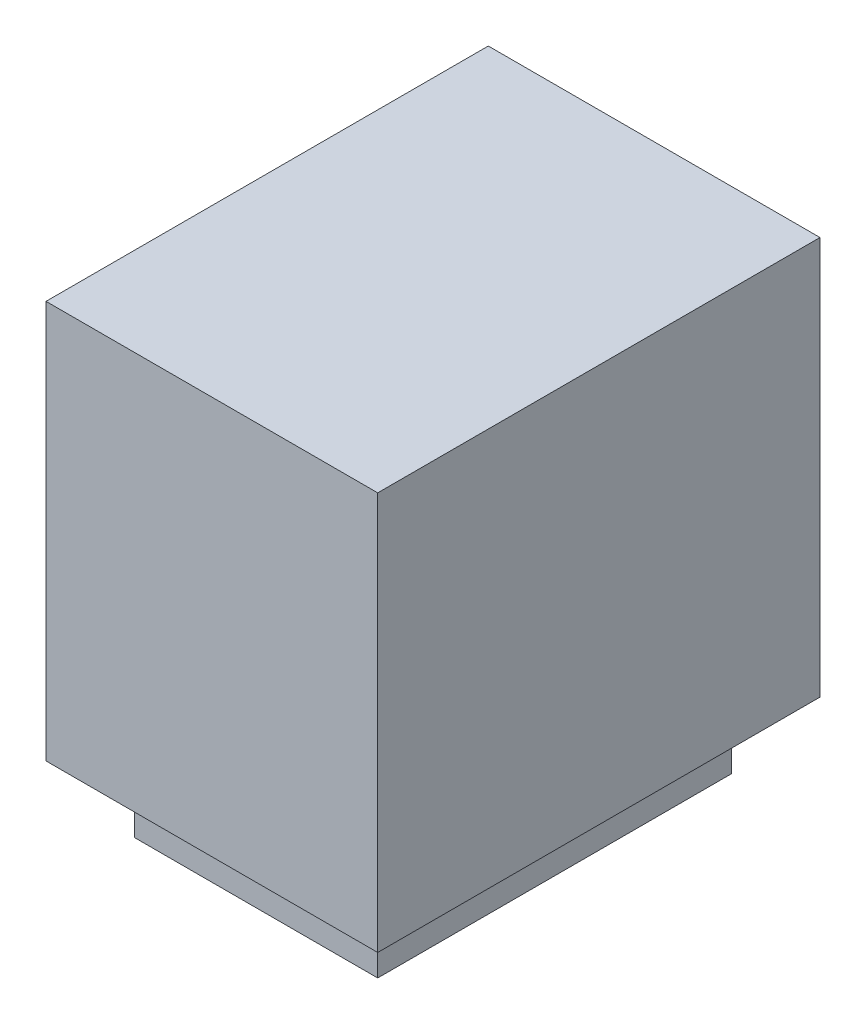
ISO-10303-21;
HEADER;
FILE_DESCRIPTION(('STEP AP214'),'2;1');
FILE_NAME('part.step','',(''),(''),'','','');
FILE_SCHEMA(('AUTOMOTIVE_DESIGN { 1 0 10303 214 1 1 1 1 }'));
ENDSEC;
DATA;
#1=APPLICATION_CONTEXT('core data for automotive mechanical design processes');
#2=APPLICATION_PROTOCOL_DEFINITION('international standard','automotive_design',2000,#1);
#3=PRODUCT_CONTEXT('',#1,'mechanical');
#4=PRODUCT('Part','Part','',(#3));
#5=PRODUCT_RELATED_PRODUCT_CATEGORY('part','',(#4));
#6=PRODUCT_DEFINITION_FORMATION('','',#4);
#7=PRODUCT_DEFINITION_CONTEXT('part definition',#1,'design');
#8=PRODUCT_DEFINITION('design','',#6,#7);
#9=PRODUCT_DEFINITION_SHAPE('','',#8);
#10=(LENGTH_UNIT() NAMED_UNIT(*) SI_UNIT(.MILLI.,.METRE.));
#11=(NAMED_UNIT(*) PLANE_ANGLE_UNIT() SI_UNIT($,.RADIAN.));
#12=(NAMED_UNIT(*) SI_UNIT($,.STERADIAN.) SOLID_ANGLE_UNIT());
#13=UNCERTAINTY_MEASURE_WITH_UNIT(LENGTH_MEASURE(1.E-05),#10,'distance_accuracy_value','');
#14=(GEOMETRIC_REPRESENTATION_CONTEXT(3) GLOBAL_UNCERTAINTY_ASSIGNED_CONTEXT((#13)) GLOBAL_UNIT_ASSIGNED_CONTEXT((#10,
#11,#12)) REPRESENTATION_CONTEXT('',''));
#15=CARTESIAN_POINT('',(0.,0.,0.));
#16=DIRECTION('',(0.,0.,1.));
#17=DIRECTION('',(1.,0.,0.));
#18=AXIS2_PLACEMENT_3D('',#15,#16,#17);
#19=CARTESIAN_POINT('',(750.,1800.,-1000.));
#20=DIRECTION('',(-1.,0.,0.));
#21=DIRECTION('',(0.,0.,1.));
#22=AXIS2_PLACEMENT_3D('',#19,#20,#21);
#23=PLANE('',#22);
#24=DIRECTION('',(0.,0.,-1.));
#25=VECTOR('',#24,1.);
#26=CARTESIAN_POINT('',(750.,0.,-1000.));
#27=LINE('',#26,#25);
#28=CARTESIAN_POINT('',(750.,0.,1000.));
#29=VERTEX_POINT('',#28);
#30=CARTESIAN_POINT('',(750.,0.,-1000.));
#31=VERTEX_POINT('',#30);
#32=EDGE_CURVE('E185',#29,#31,#27,.T.);
#33=ORIENTED_EDGE('',*,*,#32,.T.);
#34=DIRECTION('',(0.,-1.,0.));
#35=VECTOR('',#34,1.);
#36=CARTESIAN_POINT('',(750.,1800.,-1000.));
#37=LINE('',#36,#35);
#38=CARTESIAN_POINT('',(750.,1800.,-1000.));
#39=VERTEX_POINT('',#38);
#40=EDGE_CURVE('E11',#39,#31,#37,.T.);
#41=ORIENTED_EDGE('',*,*,#40,.F.);
#42=DIRECTION('',(0.,0.,-1.));
#43=VECTOR('',#42,1.);
#44=CARTESIAN_POINT('',(750.,1800.,-1000.));
#45=LINE('',#44,#43);
#46=CARTESIAN_POINT('',(750.,1800.,1000.));
#47=VERTEX_POINT('',#46);
#48=EDGE_CURVE('E191',#47,#39,#45,.T.);
#49=ORIENTED_EDGE('',*,*,#48,.F.);
#50=DIRECTION('',(0.,-1.,0.));
#51=VECTOR('',#50,1.);
#52=CARTESIAN_POINT('',(750.,1800.,1000.));
#53=LINE('',#52,#51);
#54=EDGE_CURVE('E197',#47,#29,#53,.T.);
#55=ORIENTED_EDGE('',*,*,#54,.T.);
#56=EDGE_LOOP('',(#33,#41,#49,#55));
#57=FACE_BOUND('',#56,.T.);
#58=ADVANCED_FACE('F33',(#57),#23,.F.);
#59=CARTESIAN_POINT('',(-750.,1800.,-1000.));
#60=DIRECTION('',(0.,0.,1.));
#61=DIRECTION('',(1.,0.,0.));
#62=AXIS2_PLACEMENT_3D('',#59,#60,#61);
#63=PLANE('',#62);
#64=DIRECTION('',(-1.,0.,0.));
#65=VECTOR('',#64,1.);
#66=CARTESIAN_POINT('',(-750.,0.,-1000.));
#67=LINE('',#66,#65);
#68=CARTESIAN_POINT('',(-750.,0.,-1000.));
#69=VERTEX_POINT('',#68);
#70=EDGE_CURVE('E200',#31,#69,#67,.T.);
#71=ORIENTED_EDGE('',*,*,#70,.T.);
#72=DIRECTION('',(0.,-1.,0.));
#73=VECTOR('',#72,1.);
#74=CARTESIAN_POINT('',(-750.,1800.,-1000.));
#75=LINE('',#74,#73);
#76=CARTESIAN_POINT('',(-750.,1800.,-1000.));
#77=VERTEX_POINT('',#76);
#78=EDGE_CURVE('E40',#77,#69,#75,.T.);
#79=ORIENTED_EDGE('',*,*,#78,.F.);
#80=DIRECTION('',(-1.,0.,0.));
#81=VECTOR('',#80,1.);
#82=CARTESIAN_POINT('',(-750.,1800.,-1000.));
#83=LINE('',#82,#81);
#84=EDGE_CURVE('E84',#39,#77,#83,.T.);
#85=ORIENTED_EDGE('',*,*,#84,.F.);
#86=ORIENTED_EDGE('',*,*,#40,.T.);
#87=EDGE_LOOP('',(#71,#79,#85,#86));
#88=FACE_BOUND('',#87,.T.);
#89=ADVANCED_FACE('F228',(#88),#63,.F.);
#90=CARTESIAN_POINT('',(-750.,1800.,-1000.));
#91=DIRECTION('',(1.,0.,0.));
#92=DIRECTION('',(0.,0.,-1.));
#93=AXIS2_PLACEMENT_3D('',#90,#91,#92);
#94=PLANE('',#93);
#95=DIRECTION('',(0.,0.,1.));
#96=VECTOR('',#95,1.);
#97=CARTESIAN_POINT('',(-750.,0.,-1000.));
#98=LINE('',#97,#96);
#99=CARTESIAN_POINT('',(-750.,0.,1000.));
#100=VERTEX_POINT('',#99);
#101=EDGE_CURVE('E202',#69,#100,#98,.T.);
#102=ORIENTED_EDGE('',*,*,#101,.T.);
#103=DIRECTION('',(0.,-1.,0.));
#104=VECTOR('',#103,1.);
#105=CARTESIAN_POINT('',(-750.,1800.,1000.));
#106=LINE('',#105,#104);
#107=CARTESIAN_POINT('',(-750.,1800.,1000.));
#108=VERTEX_POINT('',#107);
#109=EDGE_CURVE('E206',#108,#100,#106,.T.);
#110=ORIENTED_EDGE('',*,*,#109,.F.);
#111=DIRECTION('',(0.,0.,1.));
#112=VECTOR('',#111,1.);
#113=CARTESIAN_POINT('',(-750.,1800.,-1000.));
#114=LINE('',#113,#112);
#115=EDGE_CURVE('E194',#77,#108,#114,.T.);
#116=ORIENTED_EDGE('',*,*,#115,.F.);
#117=ORIENTED_EDGE('',*,*,#78,.T.);
#118=EDGE_LOOP('',(#102,#110,#116,#117));
#119=FACE_BOUND('',#118,.T.);
#120=ADVANCED_FACE('F211',(#119),#94,.F.);
#121=CARTESIAN_POINT('',(-750.,1800.,1000.));
#122=DIRECTION('',(0.,0.,-1.));
#123=DIRECTION('',(-1.,0.,0.));
#124=AXIS2_PLACEMENT_3D('',#121,#122,#123);
#125=PLANE('',#124);
#126=DIRECTION('',(1.,0.,0.));
#127=VECTOR('',#126,1.);
#128=CARTESIAN_POINT('',(-750.,0.,1000.));
#129=LINE('',#128,#127);
#130=EDGE_CURVE('E77',#100,#29,#129,.T.);
#131=ORIENTED_EDGE('',*,*,#130,.T.);
#132=ORIENTED_EDGE('',*,*,#54,.F.);
#133=DIRECTION('',(1.,0.,0.));
#134=VECTOR('',#133,1.);
#135=CARTESIAN_POINT('',(-750.,1800.,1000.));
#136=LINE('',#135,#134);
#137=EDGE_CURVE('E56',#108,#47,#136,.T.);
#138=ORIENTED_EDGE('',*,*,#137,.F.);
#139=ORIENTED_EDGE('',*,*,#109,.T.);
#140=EDGE_LOOP('',(#131,#132,#138,#139));
#141=FACE_BOUND('',#140,.T.);
#142=ADVANCED_FACE('F219',(#141),#125,.F.);
#143=CARTESIAN_POINT('',(0.,1800.,0.));
#144=DIRECTION('',(0.,1.,0.));
#145=DIRECTION('',(0.,0.,1.));
#146=AXIS2_PLACEMENT_3D('',#143,#144,#145);
#147=PLANE('',#146);
#148=ORIENTED_EDGE('',*,*,#48,.T.);
#149=ORIENTED_EDGE('',*,*,#84,.T.);
#150=ORIENTED_EDGE('',*,*,#115,.T.);
#151=ORIENTED_EDGE('',*,*,#137,.T.);
#152=EDGE_LOOP('',(#148,#149,#150,#151));
#153=FACE_BOUND('',#152,.T.);
#154=ADVANCED_FACE('F221',(#153),#147,.T.);
#155=CARTESIAN_POINT('',(0.,0.,0.));
#156=DIRECTION('',(0.,1.,0.));
#157=DIRECTION('',(0.,0.,1.));
#158=AXIS2_PLACEMENT_3D('',#155,#156,#157);
#159=PLANE('',#158);
#160=DIRECTION('',(1.,0.,0.));
#161=VECTOR('',#160,1.);
#162=CARTESIAN_POINT('',(-550.,0.,800.));
#163=LINE('',#162,#161);
#164=CARTESIAN_POINT('',(-550.,0.,800.));
#165=VERTEX_POINT('',#164);
#166=CARTESIAN_POINT('',(550.,0.,800.));
#167=VERTEX_POINT('',#166);
#168=EDGE_CURVE('E166',#165,#167,#163,.T.);
#169=ORIENTED_EDGE('',*,*,#168,.T.);
#170=DIRECTION('',(0.,0.,-1.));
#171=VECTOR('',#170,1.);
#172=CARTESIAN_POINT('',(550.,0.,-800.));
#173=LINE('',#172,#171);
#174=CARTESIAN_POINT('',(550.,0.,-800.));
#175=VERTEX_POINT('',#174);
#176=EDGE_CURVE('E47',#167,#175,#173,.T.);
#177=ORIENTED_EDGE('',*,*,#176,.T.);
#178=DIRECTION('',(-1.,0.,0.));
#179=VECTOR('',#178,1.);
#180=CARTESIAN_POINT('',(-550.,0.,-800.));
#181=LINE('',#180,#179);
#182=CARTESIAN_POINT('',(-550.,0.,-800.));
#183=VERTEX_POINT('',#182);
#184=EDGE_CURVE('E156',#175,#183,#181,.T.);
#185=ORIENTED_EDGE('',*,*,#184,.T.);
#186=DIRECTION('',(0.,0.,1.));
#187=VECTOR('',#186,1.);
#188=CARTESIAN_POINT('',(-550.,0.,-800.));
#189=LINE('',#188,#187);
#190=EDGE_CURVE('E178',#183,#165,#189,.T.);
#191=ORIENTED_EDGE('',*,*,#190,.T.);
#192=EDGE_LOOP('',(#169,#177,#185,#191));
#193=FACE_BOUND('',#192,.T.);
#194=ORIENTED_EDGE('',*,*,#32,.F.);
#195=ORIENTED_EDGE('',*,*,#130,.F.);
#196=ORIENTED_EDGE('',*,*,#101,.F.);
#197=ORIENTED_EDGE('',*,*,#70,.F.);
#198=EDGE_LOOP('',(#194,#195,#196,#197));
#199=FACE_BOUND('',#198,.T.);
#200=ADVANCED_FACE('F215',(#193,#199),#159,.F.);
#201=CARTESIAN_POINT('',(550.,-300.,-800.));
#202=DIRECTION('',(1.,0.,0.));
#203=DIRECTION('',(0.,0.,-1.));
#204=AXIS2_PLACEMENT_3D('',#201,#202,#203);
#205=PLANE('',#204);
#206=ORIENTED_EDGE('',*,*,#176,.F.);
#207=DIRECTION('',(0.,1.,0.));
#208=VECTOR('',#207,1.);
#209=CARTESIAN_POINT('',(550.,-300.,800.));
#210=LINE('',#209,#208);
#211=CARTESIAN_POINT('',(550.,-300.,800.));
#212=VERTEX_POINT('',#211);
#213=EDGE_CURVE('E183',#212,#167,#210,.T.);
#214=ORIENTED_EDGE('',*,*,#213,.F.);
#215=DIRECTION('',(0.,0.,-1.));
#216=VECTOR('',#215,1.);
#217=CARTESIAN_POINT('',(550.,-300.,-800.));
#218=LINE('',#217,#216);
#219=CARTESIAN_POINT('',(550.,-300.,-800.));
#220=VERTEX_POINT('',#219);
#221=EDGE_CURVE('E162',#212,#220,#218,.T.);
#222=ORIENTED_EDGE('',*,*,#221,.T.);
#223=DIRECTION('',(0.,1.,0.));
#224=VECTOR('',#223,1.);
#225=CARTESIAN_POINT('',(550.,-300.,-800.));
#226=LINE('',#225,#224);
#227=EDGE_CURVE('E174',#220,#175,#226,.T.);
#228=ORIENTED_EDGE('',*,*,#227,.T.);
#229=EDGE_LOOP('',(#206,#214,#222,#228));
#230=FACE_BOUND('',#229,.T.);
#231=ADVANCED_FACE('F260',(#230),#205,.T.);
#232=CARTESIAN_POINT('',(-550.,-300.,800.));
#233=DIRECTION('',(0.,0.,1.));
#234=DIRECTION('',(1.,0.,0.));
#235=AXIS2_PLACEMENT_3D('',#232,#233,#234);
#236=PLANE('',#235);
#237=ORIENTED_EDGE('',*,*,#168,.F.);
#238=DIRECTION('',(0.,1.,0.));
#239=VECTOR('',#238,1.);
#240=CARTESIAN_POINT('',(-550.,-300.,800.));
#241=LINE('',#240,#239);
#242=CARTESIAN_POINT('',(-550.,-300.,800.));
#243=VERTEX_POINT('',#242);
#244=EDGE_CURVE('E186',#243,#165,#241,.T.);
#245=ORIENTED_EDGE('',*,*,#244,.F.);
#246=DIRECTION('',(1.,0.,0.));
#247=VECTOR('',#246,1.);
#248=CARTESIAN_POINT('',(-550.,-300.,800.));
#249=LINE('',#248,#247);
#250=EDGE_CURVE('E172',#243,#212,#249,.T.);
#251=ORIENTED_EDGE('',*,*,#250,.T.);
#252=ORIENTED_EDGE('',*,*,#213,.T.);
#253=EDGE_LOOP('',(#237,#245,#251,#252));
#254=FACE_BOUND('',#253,.T.);
#255=ADVANCED_FACE('F269',(#254),#236,.T.);
#256=CARTESIAN_POINT('',(-550.,-300.,-800.));
#257=DIRECTION('',(-1.,0.,0.));
#258=DIRECTION('',(0.,0.,1.));
#259=AXIS2_PLACEMENT_3D('',#256,#257,#258);
#260=PLANE('',#259);
#261=ORIENTED_EDGE('',*,*,#190,.F.);
#262=DIRECTION('',(0.,1.,0.));
#263=VECTOR('',#262,1.);
#264=CARTESIAN_POINT('',(-550.,-300.,-800.));
#265=LINE('',#264,#263);
#266=CARTESIAN_POINT('',(-550.,-300.,-800.));
#267=VERTEX_POINT('',#266);
#268=EDGE_CURVE('E188',#267,#183,#265,.T.);
#269=ORIENTED_EDGE('',*,*,#268,.F.);
#270=DIRECTION('',(0.,0.,1.));
#271=VECTOR('',#270,1.);
#272=CARTESIAN_POINT('',(-550.,-300.,-800.));
#273=LINE('',#272,#271);
#274=EDGE_CURVE('E169',#267,#243,#273,.T.);
#275=ORIENTED_EDGE('',*,*,#274,.T.);
#276=ORIENTED_EDGE('',*,*,#244,.T.);
#277=EDGE_LOOP('',(#261,#269,#275,#276));
#278=FACE_BOUND('',#277,.T.);
#279=ADVANCED_FACE('F278',(#278),#260,.T.);
#280=CARTESIAN_POINT('',(-550.,-300.,-800.));
#281=DIRECTION('',(0.,0.,-1.));
#282=DIRECTION('',(-1.,0.,0.));
#283=AXIS2_PLACEMENT_3D('',#280,#281,#282);
#284=PLANE('',#283);
#285=ORIENTED_EDGE('',*,*,#184,.F.);
#286=ORIENTED_EDGE('',*,*,#227,.F.);
#287=DIRECTION('',(-1.,0.,0.));
#288=VECTOR('',#287,1.);
#289=CARTESIAN_POINT('',(-550.,-300.,-800.));
#290=LINE('',#289,#288);
#291=EDGE_CURVE('E165',#220,#267,#290,.T.);
#292=ORIENTED_EDGE('',*,*,#291,.T.);
#293=ORIENTED_EDGE('',*,*,#268,.T.);
#294=EDGE_LOOP('',(#285,#286,#292,#293));
#295=FACE_BOUND('',#294,.T.);
#296=ADVANCED_FACE('F288',(#295),#284,.T.);
#297=CARTESIAN_POINT('',(0.,-300.,0.));
#298=DIRECTION('',(0.,1.,0.));
#299=DIRECTION('',(0.,0.,1.));
#300=AXIS2_PLACEMENT_3D('',#297,#298,#299);
#301=PLANE('',#300);
#302=ORIENTED_EDGE('',*,*,#221,.F.);
#303=ORIENTED_EDGE('',*,*,#250,.F.);
#304=ORIENTED_EDGE('',*,*,#274,.F.);
#305=ORIENTED_EDGE('',*,*,#291,.F.);
#306=EDGE_LOOP('',(#302,#303,#304,#305));
#307=FACE_BOUND('',#306,.T.);
#308=ADVANCED_FACE('F298',(#307),#301,.F.);
#309=CLOSED_SHELL('',(#58,#89,#120,#142,#154,#200,#231,#255,#279,#296,#308));
#310=CARTESIAN_POINT('',(445.537260282923,1500.,50.));
#311=DIRECTION('',(-1.,0.,0.));
#312=DIRECTION('',(0.,0.,1.));
#313=AXIS2_PLACEMENT_3D('',#310,#311,#312);
#314=PLANE('',#313);
#315=DIRECTION('',(0.,1.,0.));
#316=VECTOR('',#315,1.);
#317=CARTESIAN_POINT('',(445.537260282923,1500.,0.));
#318=LINE('',#317,#316);
#319=CARTESIAN_POINT('',(445.537260282923,300.,0.));
#320=VERTEX_POINT('',#319);
#321=CARTESIAN_POINT('',(445.537260282923,1500.,0.));
#322=VERTEX_POINT('',#321);
#323=EDGE_CURVE('E368',#320,#322,#318,.T.);
#324=ORIENTED_EDGE('',*,*,#323,.F.);
#325=DIRECTION('',(0.,0.,-1.));
#326=VECTOR('',#325,1.);
#327=CARTESIAN_POINT('',(445.537260282923,300.,50.));
#328=LINE('',#327,#326);
#329=CARTESIAN_POINT('',(445.537260282923,300.,50.));
#330=VERTEX_POINT('',#329);
#331=EDGE_CURVE('E149',#330,#320,#328,.T.);
#332=ORIENTED_EDGE('',*,*,#331,.F.);
#333=DIRECTION('',(0.,1.,0.));
#334=VECTOR('',#333,1.);
#335=CARTESIAN_POINT('',(445.537260282923,1500.,50.));
#336=LINE('',#335,#334);
#337=CARTESIAN_POINT('',(445.537260282923,1500.,50.));
#338=VERTEX_POINT('',#337);
#339=EDGE_CURVE('E134',#330,#338,#336,.T.);
#340=ORIENTED_EDGE('',*,*,#339,.T.);
#341=DIRECTION('',(0.,0.,-1.));
#342=VECTOR('',#341,1.);
#343=CARTESIAN_POINT('',(445.537260282923,1500.,50.));
#344=LINE('',#343,#342);
#345=EDGE_CURVE('E146',#338,#322,#344,.T.);
#346=ORIENTED_EDGE('',*,*,#345,.T.);
#347=EDGE_LOOP('',(#324,#332,#340,#346));
#348=FACE_BOUND('',#347,.T.);
#349=ADVANCED_FACE('F145',(#348),#314,.T.);
#350=CARTESIAN_POINT('',(-454.462739717077,1500.,50.));
#351=DIRECTION('',(0.,-1.,0.));
#352=DIRECTION('',(0.,0.,-1.));
#353=AXIS2_PLACEMENT_3D('',#350,#351,#352);
#354=PLANE('',#353);
#355=DIRECTION('',(-1.,0.,0.));
#356=VECTOR('',#355,1.);
#357=CARTESIAN_POINT('',(-454.462739717077,1500.,0.));
#358=LINE('',#357,#356);
#359=CARTESIAN_POINT('',(-454.462739717077,1500.,0.));
#360=VERTEX_POINT('',#359);
#361=EDGE_CURVE('E153',#322,#360,#358,.T.);
#362=ORIENTED_EDGE('',*,*,#361,.F.);
#363=ORIENTED_EDGE('',*,*,#345,.F.);
#364=DIRECTION('',(-1.,0.,0.));
#365=VECTOR('',#364,1.);
#366=CARTESIAN_POINT('',(-454.462739717077,1500.,50.));
#367=LINE('',#366,#365);
#368=CARTESIAN_POINT('',(-454.462739717077,1500.,50.));
#369=VERTEX_POINT('',#368);
#370=EDGE_CURVE('E130',#338,#369,#367,.T.);
#371=ORIENTED_EDGE('',*,*,#370,.T.);
#372=DIRECTION('',(0.,0.,-1.));
#373=VECTOR('',#372,1.);
#374=CARTESIAN_POINT('',(-454.462739717077,1500.,50.));
#375=LINE('',#374,#373);
#376=EDGE_CURVE('E154',#369,#360,#375,.T.);
#377=ORIENTED_EDGE('',*,*,#376,.T.);
#378=EDGE_LOOP('',(#362,#363,#371,#377));
#379=FACE_BOUND('',#378,.T.);
#380=ADVANCED_FACE('F152',(#379),#354,.T.);
#381=CARTESIAN_POINT('',(-454.462739717077,1500.,50.));
#382=DIRECTION('',(1.,0.,0.));
#383=DIRECTION('',(0.,0.,-1.));
#384=AXIS2_PLACEMENT_3D('',#381,#382,#383);
#385=PLANE('',#384);
#386=DIRECTION('',(0.,-1.,0.));
#387=VECTOR('',#386,1.);
#388=CARTESIAN_POINT('',(-454.462739717077,1500.,0.));
#389=LINE('',#388,#387);
#390=CARTESIAN_POINT('',(-454.462739717077,300.,0.));
#391=VERTEX_POINT('',#390);
#392=EDGE_CURVE('E371',#360,#391,#389,.T.);
#393=ORIENTED_EDGE('',*,*,#392,.F.);
#394=ORIENTED_EDGE('',*,*,#376,.F.);
#395=DIRECTION('',(0.,-1.,0.));
#396=VECTOR('',#395,1.);
#397=CARTESIAN_POINT('',(-454.462739717077,1500.,50.));
#398=LINE('',#397,#396);
#399=CARTESIAN_POINT('',(-454.462739717077,300.,50.));
#400=VERTEX_POINT('',#399);
#401=EDGE_CURVE('E135',#369,#400,#398,.T.);
#402=ORIENTED_EDGE('',*,*,#401,.T.);
#403=DIRECTION('',(0.,0.,-1.));
#404=VECTOR('',#403,1.);
#405=CARTESIAN_POINT('',(-454.462739717077,300.,50.));
#406=LINE('',#405,#404);
#407=EDGE_CURVE('E158',#400,#391,#406,.T.);
#408=ORIENTED_EDGE('',*,*,#407,.T.);
#409=EDGE_LOOP('',(#393,#394,#402,#408));
#410=FACE_BOUND('',#409,.T.);
#411=ADVANCED_FACE('F326',(#410),#385,.T.);
#412=CARTESIAN_POINT('',(-454.462739717077,300.,50.));
#413=DIRECTION('',(0.,1.,0.));
#414=DIRECTION('',(0.,0.,1.));
#415=AXIS2_PLACEMENT_3D('',#412,#413,#414);
#416=PLANE('',#415);
#417=DIRECTION('',(1.,0.,0.));
#418=VECTOR('',#417,1.);
#419=CARTESIAN_POINT('',(-454.462739717077,300.,0.));
#420=LINE('',#419,#418);
#421=EDGE_CURVE('E150',#391,#320,#420,.T.);
#422=ORIENTED_EDGE('',*,*,#421,.F.);
#423=ORIENTED_EDGE('',*,*,#407,.F.);
#424=DIRECTION('',(1.,0.,0.));
#425=VECTOR('',#424,1.);
#426=CARTESIAN_POINT('',(-454.462739717077,300.,50.));
#427=LINE('',#426,#425);
#428=EDGE_CURVE('E374',#400,#330,#427,.T.);
#429=ORIENTED_EDGE('',*,*,#428,.T.);
#430=ORIENTED_EDGE('',*,*,#331,.T.);
#431=EDGE_LOOP('',(#422,#423,#429,#430));
#432=FACE_BOUND('',#431,.T.);
#433=ADVANCED_FACE('F335',(#432),#416,.T.);
#434=CARTESIAN_POINT('',(0.,0.,50.));
#435=DIRECTION('',(0.,0.,1.));
#436=DIRECTION('',(1.,0.,0.));
#437=AXIS2_PLACEMENT_3D('',#434,#435,#436);
#438=PLANE('',#437);
#439=ORIENTED_EDGE('',*,*,#339,.F.);
#440=ORIENTED_EDGE('',*,*,#428,.F.);
#441=ORIENTED_EDGE('',*,*,#401,.F.);
#442=ORIENTED_EDGE('',*,*,#370,.F.);
#443=EDGE_LOOP('',(#439,#440,#441,#442));
#444=FACE_BOUND('',#443,.T.);
#445=ADVANCED_FACE('F132',(#444),#438,.F.);
#446=CARTESIAN_POINT('',(0.,0.,0.));
#447=DIRECTION('',(0.,0.,1.));
#448=DIRECTION('',(1.,0.,0.));
#449=AXIS2_PLACEMENT_3D('',#446,#447,#448);
#450=PLANE('',#449);
#451=ORIENTED_EDGE('',*,*,#323,.T.);
#452=ORIENTED_EDGE('',*,*,#361,.T.);
#453=ORIENTED_EDGE('',*,*,#392,.T.);
#454=ORIENTED_EDGE('',*,*,#421,.T.);
#455=EDGE_LOOP('',(#451,#452,#453,#454));
#456=FACE_BOUND('',#455,.T.);
#457=ADVANCED_FACE('F354',(#456),#450,.T.);
#458=CLOSED_SHELL('',(#349,#380,#411,#433,#445,#457));
#459=ORIENTED_CLOSED_SHELL('',*,#458,.T.);
#460=BREP_WITH_VOIDS('B2',#309,(#459));
#461=ADVANCED_BREP_SHAPE_REPRESENTATION('',(#18,#460),#14);
#462=SHAPE_DEFINITION_REPRESENTATION(#9,#461);
ENDSEC;
END-ISO-10303-21;
